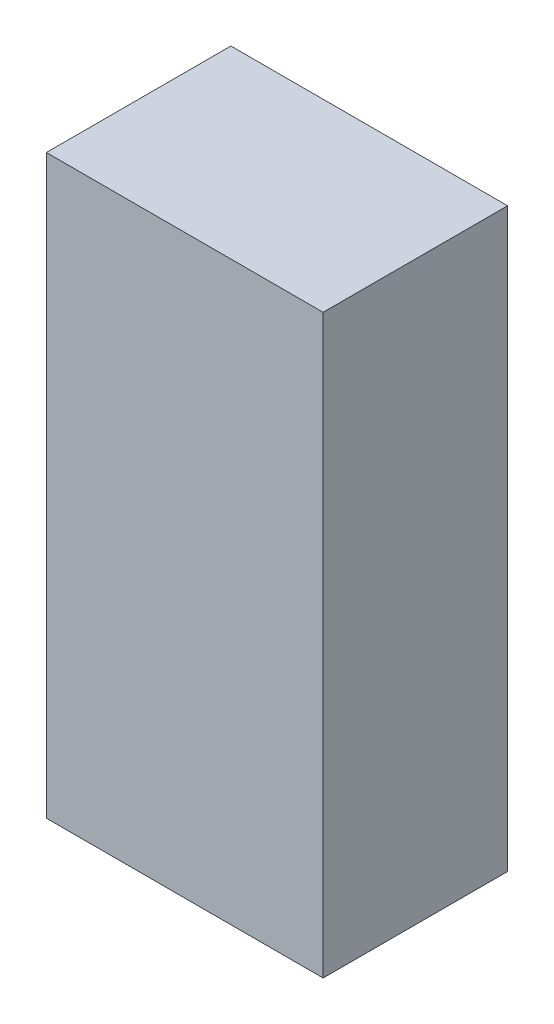
ISO-10303-21;
HEADER;
FILE_DESCRIPTION(('STEP AP214'),'2;1');
FILE_NAME('part.step','',(''),(''),'','','');
FILE_SCHEMA(('AUTOMOTIVE_DESIGN { 1 0 10303 214 1 1 1 1 }'));
ENDSEC;
DATA;
#1=APPLICATION_CONTEXT('core data for automotive mechanical design processes');
#2=APPLICATION_PROTOCOL_DEFINITION('international standard','automotive_design',2000,#1);
#3=PRODUCT_CONTEXT('',#1,'mechanical');
#4=PRODUCT('Part','Part','',(#3));
#5=PRODUCT_RELATED_PRODUCT_CATEGORY('part','',(#4));
#6=PRODUCT_DEFINITION_FORMATION('','',#4);
#7=PRODUCT_DEFINITION_CONTEXT('part definition',#1,'design');
#8=PRODUCT_DEFINITION('design','',#6,#7);
#9=PRODUCT_DEFINITION_SHAPE('','',#8);
#10=(LENGTH_UNIT() NAMED_UNIT(*) SI_UNIT(.MILLI.,.METRE.));
#11=(NAMED_UNIT(*) PLANE_ANGLE_UNIT() SI_UNIT($,.RADIAN.));
#12=(NAMED_UNIT(*) SI_UNIT($,.STERADIAN.) SOLID_ANGLE_UNIT());
#13=UNCERTAINTY_MEASURE_WITH_UNIT(LENGTH_MEASURE(1.E-05),#10,'distance_accuracy_value','');
#14=(GEOMETRIC_REPRESENTATION_CONTEXT(3) GLOBAL_UNCERTAINTY_ASSIGNED_CONTEXT((#13)) GLOBAL_UNIT_ASSIGNED_CONTEXT((#10,
#11,#12)) REPRESENTATION_CONTEXT('',''));
#15=CARTESIAN_POINT('',(0.,0.,0.));
#16=DIRECTION('',(0.,0.,1.));
#17=DIRECTION('',(1.,0.,0.));
#18=AXIS2_PLACEMENT_3D('',#15,#16,#17);
#19=CARTESIAN_POINT('',(6.,-12.5,8.));
#20=DIRECTION('',(-1.,0.,0.));
#21=DIRECTION('',(0.,0.,1.));
#22=AXIS2_PLACEMENT_3D('',#19,#20,#21);
#23=PLANE('',#22);
#24=DIRECTION('',(0.,1.,0.));
#25=VECTOR('',#24,1.);
#26=CARTESIAN_POINT('',(6.,-12.5,0.));
#27=LINE('',#26,#25);
#28=CARTESIAN_POINT('',(6.,-12.5,0.));
#29=VERTEX_POINT('',#28);
#30=CARTESIAN_POINT('',(6.,12.5,0.));
#31=VERTEX_POINT('',#30);
#32=EDGE_CURVE('E102',#29,#31,#27,.T.);
#33=ORIENTED_EDGE('',*,*,#32,.T.);
#34=DIRECTION('',(0.,0.,-1.));
#35=VECTOR('',#34,1.);
#36=CARTESIAN_POINT('',(6.,12.5,8.));
#37=LINE('',#36,#35);
#38=CARTESIAN_POINT('',(6.,12.5,8.));
#39=VERTEX_POINT('',#38);
#40=EDGE_CURVE('E11',#39,#31,#37,.T.);
#41=ORIENTED_EDGE('',*,*,#40,.F.);
#42=DIRECTION('',(0.,1.,0.));
#43=VECTOR('',#42,1.);
#44=CARTESIAN_POINT('',(6.,-12.5,8.));
#45=LINE('',#44,#43);
#46=CARTESIAN_POINT('',(6.,-12.5,8.));
#47=VERTEX_POINT('',#46);
#48=EDGE_CURVE('E90',#47,#39,#45,.T.);
#49=ORIENTED_EDGE('',*,*,#48,.F.);
#50=DIRECTION('',(0.,0.,-1.));
#51=VECTOR('',#50,1.);
#52=CARTESIAN_POINT('',(6.,-12.5,8.));
#53=LINE('',#52,#51);
#54=EDGE_CURVE('E98',#47,#29,#53,.T.);
#55=ORIENTED_EDGE('',*,*,#54,.T.);
#56=EDGE_LOOP('',(#33,#41,#49,#55));
#57=FACE_BOUND('',#56,.T.);
#58=ADVANCED_FACE('F39',(#57),#23,.F.);
#59=CARTESIAN_POINT('',(-6.,12.5,8.));
#60=DIRECTION('',(0.,-1.,0.));
#61=DIRECTION('',(0.,0.,-1.));
#62=AXIS2_PLACEMENT_3D('',#59,#60,#61);
#63=PLANE('',#62);
#64=DIRECTION('',(-1.,0.,0.));
#65=VECTOR('',#64,1.);
#66=CARTESIAN_POINT('',(-6.,12.5,0.));
#67=LINE('',#66,#65);
#68=CARTESIAN_POINT('',(-6.,12.5,0.));
#69=VERTEX_POINT('',#68);
#70=EDGE_CURVE('E94',#31,#69,#67,.T.);
#71=ORIENTED_EDGE('',*,*,#70,.T.);
#72=DIRECTION('',(0.,0.,-1.));
#73=VECTOR('',#72,1.);
#74=CARTESIAN_POINT('',(-6.,12.5,8.));
#75=LINE('',#74,#73);
#76=CARTESIAN_POINT('',(-6.,12.5,8.));
#77=VERTEX_POINT('',#76);
#78=EDGE_CURVE('E47',#77,#69,#75,.T.);
#79=ORIENTED_EDGE('',*,*,#78,.F.);
#80=DIRECTION('',(-1.,0.,0.));
#81=VECTOR('',#80,1.);
#82=CARTESIAN_POINT('',(-6.,12.5,8.));
#83=LINE('',#82,#81);
#84=EDGE_CURVE('E85',#39,#77,#83,.T.);
#85=ORIENTED_EDGE('',*,*,#84,.F.);
#86=ORIENTED_EDGE('',*,*,#40,.T.);
#87=EDGE_LOOP('',(#71,#79,#85,#86));
#88=FACE_BOUND('',#87,.T.);
#89=ADVANCED_FACE('F93',(#88),#63,.F.);
#90=CARTESIAN_POINT('',(-6.,-12.5,8.));
#91=DIRECTION('',(1.,0.,0.));
#92=DIRECTION('',(0.,0.,-1.));
#93=AXIS2_PLACEMENT_3D('',#90,#91,#92);
#94=PLANE('',#93);
#95=DIRECTION('',(0.,-1.,0.));
#96=VECTOR('',#95,1.);
#97=CARTESIAN_POINT('',(-6.,-12.5,0.));
#98=LINE('',#97,#96);
#99=CARTESIAN_POINT('',(-6.,-12.5,0.));
#100=VERTEX_POINT('',#99);
#101=EDGE_CURVE('E72',#69,#100,#98,.T.);
#102=ORIENTED_EDGE('',*,*,#101,.T.);
#103=DIRECTION('',(0.,0.,-1.));
#104=VECTOR('',#103,1.);
#105=CARTESIAN_POINT('',(-6.,-12.5,8.));
#106=LINE('',#105,#104);
#107=CARTESIAN_POINT('',(-6.,-12.5,8.));
#108=VERTEX_POINT('',#107);
#109=EDGE_CURVE('E95',#108,#100,#106,.T.);
#110=ORIENTED_EDGE('',*,*,#109,.F.);
#111=DIRECTION('',(0.,-1.,0.));
#112=VECTOR('',#111,1.);
#113=CARTESIAN_POINT('',(-6.,-12.5,8.));
#114=LINE('',#113,#112);
#115=EDGE_CURVE('E88',#77,#108,#114,.T.);
#116=ORIENTED_EDGE('',*,*,#115,.F.);
#117=ORIENTED_EDGE('',*,*,#78,.T.);
#118=EDGE_LOOP('',(#102,#110,#116,#117));
#119=FACE_BOUND('',#118,.T.);
#120=ADVANCED_FACE('F96',(#119),#94,.F.);
#121=CARTESIAN_POINT('',(-6.,-12.5,8.));
#122=DIRECTION('',(0.,1.,0.));
#123=DIRECTION('',(0.,0.,1.));
#124=AXIS2_PLACEMENT_3D('',#121,#122,#123);
#125=PLANE('',#124);
#126=DIRECTION('',(1.,0.,0.));
#127=VECTOR('',#126,1.);
#128=CARTESIAN_POINT('',(-6.,-12.5,0.));
#129=LINE('',#128,#127);
#130=EDGE_CURVE('E78',#100,#29,#129,.T.);
#131=ORIENTED_EDGE('',*,*,#130,.T.);
#132=ORIENTED_EDGE('',*,*,#54,.F.);
#133=DIRECTION('',(1.,0.,0.));
#134=VECTOR('',#133,1.);
#135=CARTESIAN_POINT('',(-6.,-12.5,8.));
#136=LINE('',#135,#134);
#137=EDGE_CURVE('E55',#108,#47,#136,.T.);
#138=ORIENTED_EDGE('',*,*,#137,.F.);
#139=ORIENTED_EDGE('',*,*,#109,.T.);
#140=EDGE_LOOP('',(#131,#132,#138,#139));
#141=FACE_BOUND('',#140,.T.);
#142=ADVANCED_FACE('F109',(#141),#125,.F.);
#143=CARTESIAN_POINT('',(0.,0.,8.));
#144=DIRECTION('',(0.,0.,-1.));
#145=DIRECTION('',(-1.,0.,0.));
#146=AXIS2_PLACEMENT_3D('',#143,#144,#145);
#147=PLANE('',#146);
#148=ORIENTED_EDGE('',*,*,#48,.T.);
#149=ORIENTED_EDGE('',*,*,#84,.T.);
#150=ORIENTED_EDGE('',*,*,#115,.T.);
#151=ORIENTED_EDGE('',*,*,#137,.T.);
#152=EDGE_LOOP('',(#148,#149,#150,#151));
#153=FACE_BOUND('',#152,.T.);
#154=ADVANCED_FACE('F86',(#153),#147,.F.);
#155=CARTESIAN_POINT('',(0.,0.,0.));
#156=DIRECTION('',(0.,0.,-1.));
#157=DIRECTION('',(-1.,0.,0.));
#158=AXIS2_PLACEMENT_3D('',#155,#156,#157);
#159=PLANE('',#158);
#160=ORIENTED_EDGE('',*,*,#32,.F.);
#161=ORIENTED_EDGE('',*,*,#130,.F.);
#162=ORIENTED_EDGE('',*,*,#101,.F.);
#163=ORIENTED_EDGE('',*,*,#70,.F.);
#164=EDGE_LOOP('',(#160,#161,#162,#163));
#165=FACE_BOUND('',#164,.T.);
#166=ADVANCED_FACE('F112',(#165),#159,.T.);
#167=CLOSED_SHELL('',(#58,#89,#120,#142,#154,#166));
#168=MANIFOLD_SOLID_BREP('B2',#167);
#169=ADVANCED_BREP_SHAPE_REPRESENTATION('',(#18,#168),#14);
#170=SHAPE_DEFINITION_REPRESENTATION(#9,#169);
ENDSEC;
END-ISO-10303-21;
